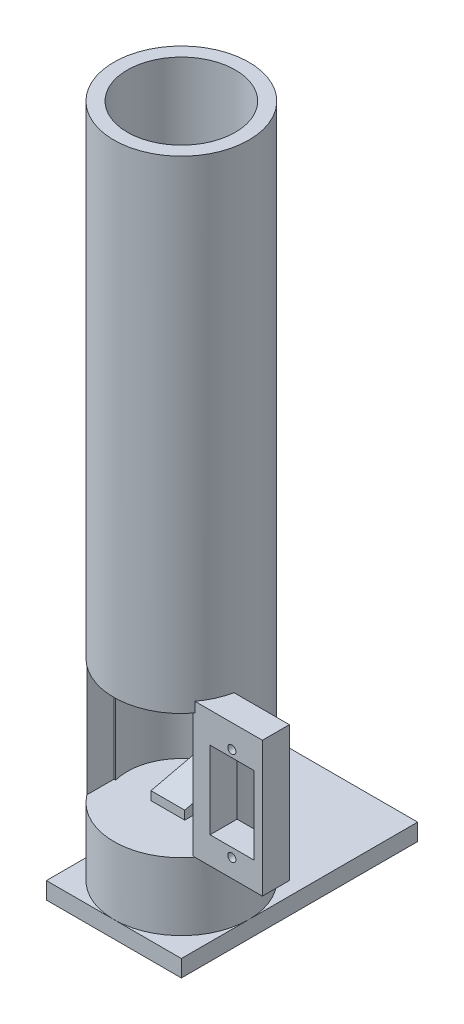
ISO-10303-21;
HEADER;
FILE_DESCRIPTION(('STEP AP214'),'2;1');
FILE_NAME('part.step','',(''),(''),'','','');
FILE_SCHEMA(('AUTOMOTIVE_DESIGN { 1 0 10303 214 1 1 1 1 }'));
ENDSEC;
DATA;
#1=APPLICATION_CONTEXT('core data for automotive mechanical design processes');
#2=APPLICATION_PROTOCOL_DEFINITION('international standard','automotive_design',2000,#1);
#3=PRODUCT_CONTEXT('',#1,'mechanical');
#4=PRODUCT('Part','Part','',(#3));
#5=PRODUCT_RELATED_PRODUCT_CATEGORY('part','',(#4));
#6=PRODUCT_DEFINITION_FORMATION('','',#4);
#7=PRODUCT_DEFINITION_CONTEXT('part definition',#1,'design');
#8=PRODUCT_DEFINITION('design','',#6,#7);
#9=PRODUCT_DEFINITION_SHAPE('','',#8);
#10=(LENGTH_UNIT() NAMED_UNIT(*) SI_UNIT(.MILLI.,.METRE.));
#11=(NAMED_UNIT(*) PLANE_ANGLE_UNIT() SI_UNIT($,.RADIAN.));
#12=(NAMED_UNIT(*) SI_UNIT($,.STERADIAN.) SOLID_ANGLE_UNIT());
#13=UNCERTAINTY_MEASURE_WITH_UNIT(LENGTH_MEASURE(1.E-05),#10,'distance_accuracy_value','');
#14=(GEOMETRIC_REPRESENTATION_CONTEXT(3) GLOBAL_UNCERTAINTY_ASSIGNED_CONTEXT((#13)) GLOBAL_UNIT_ASSIGNED_CONTEXT((#10,
#11,#12)) REPRESENTATION_CONTEXT('',''));
#15=CARTESIAN_POINT('',(0.,0.,0.));
#16=DIRECTION('',(0.,0.,1.));
#17=DIRECTION('',(1.,0.,0.));
#18=AXIS2_PLACEMENT_3D('',#15,#16,#17);
#19=CARTESIAN_POINT('',(20.,25.,20.));
#20=DIRECTION('',(0.,-1.,0.));
#21=DIRECTION('',(0.,0.,-1.));
#22=AXIS2_PLACEMENT_3D('',#19,#20,#21);
#23=CYLINDRICAL_SURFACE('',#22,20.);
#24=CARTESIAN_POINT('',(20.,205.,20.));
#25=DIRECTION('',(0.,1.,0.));
#26=DIRECTION('',(1.,0.,0.));
#27=AXIS2_PLACEMENT_3D('',#24,#25,#26);
#28=CIRCLE('',#27,20.);
#29=CARTESIAN_POINT('',(40.,205.,20.));
#30=VERTEX_POINT('',#29);
#31=EDGE_CURVE('E369',#30,#30,#28,.T.);
#32=ORIENTED_EDGE('',*,*,#31,.F.);
#33=EDGE_LOOP('',(#32));
#34=FACE_BOUND('',#33,.T.);
#35=CARTESIAN_POINT('',(20.,5.,20.));
#36=DIRECTION('',(0.,1.,0.));
#37=DIRECTION('',(0.,0.,1.));
#38=AXIS2_PLACEMENT_3D('',#35,#36,#37);
#39=CIRCLE('',#38,20.);
#40=CARTESIAN_POINT('',(20.,5.,40.));
#41=VERTEX_POINT('',#40);
#42=CARTESIAN_POINT('',(40.,5.,20.));
#43=VERTEX_POINT('',#42);
#44=EDGE_CURVE('E402',#41,#43,#39,.T.);
#45=ORIENTED_EDGE('',*,*,#44,.T.);
#46=CARTESIAN_POINT('',(0.,5.,20.));
#47=VERTEX_POINT('',#46);
#48=EDGE_CURVE('E407',#43,#47,#39,.T.);
#49=ORIENTED_EDGE('',*,*,#48,.T.);
#50=EDGE_CURVE('E408',#47,#41,#39,.T.);
#51=ORIENTED_EDGE('',*,*,#50,.T.);
#52=EDGE_LOOP('',(#45,#49,#51));
#53=FACE_BOUND('',#52,.T.);
#54=DIRECTION('',(0.,-1.,0.));
#55=VECTOR('',#54,1.);
#56=CARTESIAN_POINT('',(36.,25.,32.));
#57=LINE('',#56,#55);
#58=CARTESIAN_POINT('',(36.,65.,32.));
#59=VERTEX_POINT('',#58);
#60=CARTESIAN_POINT('',(36.,62.,32.));
#61=VERTEX_POINT('',#60);
#62=EDGE_CURVE('E315',#59,#61,#57,.T.);
#63=ORIENTED_EDGE('',*,*,#62,.F.);
#64=CARTESIAN_POINT('',(20.,65.,20.));
#65=DIRECTION('',(0.,-1.,0.));
#66=DIRECTION('',(1.,0.,0.));
#67=AXIS2_PLACEMENT_3D('',#64,#65,#66);
#68=CIRCLE('',#67,20.);
#69=CARTESIAN_POINT('',(39.5959179422654,65.,24.));
#70=VERTEX_POINT('',#69);
#71=EDGE_CURVE('E460',#70,#59,#68,.T.);
#72=ORIENTED_EDGE('',*,*,#71,.F.);
#73=DIRECTION('',(0.,-1.,0.));
#74=VECTOR('',#73,1.);
#75=CARTESIAN_POINT('',(39.5959179422654,25.,24.));
#76=LINE('',#75,#74);
#77=CARTESIAN_POINT('',(39.5959179422654,25.,24.));
#78=VERTEX_POINT('',#77);
#79=EDGE_CURVE('E311',#78,#70,#76,.F.);
#80=ORIENTED_EDGE('',*,*,#79,.F.);
#81=CARTESIAN_POINT('',(20.,25.,20.));
#82=DIRECTION('',(0.,1.,0.));
#83=DIRECTION('',(0.,0.,1.));
#84=AXIS2_PLACEMENT_3D('',#81,#82,#83);
#85=CIRCLE('',#84,20.);
#86=CARTESIAN_POINT('',(36.,25.,32.));
#87=VERTEX_POINT('',#86);
#88=EDGE_CURVE('E307',#87,#78,#85,.T.);
#89=ORIENTED_EDGE('',*,*,#88,.F.);
#90=CARTESIAN_POINT('',(20.,25.,20.));
#91=DIRECTION('',(0.,-1.,0.));
#92=DIRECTION('',(0.,0.,-1.));
#93=AXIS2_PLACEMENT_3D('',#90,#91,#92);
#94=CIRCLE('',#93,20.);
#95=CARTESIAN_POINT('',(4.00000000000002,25.,32.));
#96=VERTEX_POINT('',#95);
#97=EDGE_CURVE('E358',#87,#96,#94,.T.);
#98=ORIENTED_EDGE('',*,*,#97,.T.);
#99=DIRECTION('',(0.,-1.,0.));
#100=VECTOR('',#99,1.);
#101=CARTESIAN_POINT('',(4.00000000000002,25.,32.));
#102=LINE('',#101,#100);
#103=CARTESIAN_POINT('',(4.00000000000001,62.,32.));
#104=VERTEX_POINT('',#103);
#105=EDGE_CURVE('E448',#96,#104,#102,.F.);
#106=ORIENTED_EDGE('',*,*,#105,.T.);
#107=CARTESIAN_POINT('',(20.,62.,20.));
#108=DIRECTION('',(0.,1.,0.));
#109=DIRECTION('',(0.,0.,1.));
#110=AXIS2_PLACEMENT_3D('',#107,#108,#109);
#111=CIRCLE('',#110,20.);
#112=EDGE_CURVE('E361',#104,#61,#111,.T.);
#113=ORIENTED_EDGE('',*,*,#112,.T.);
#114=EDGE_LOOP('',(#63,#72,#80,#89,#98,#106,#113));
#115=FACE_BOUND('',#114,.T.);
#116=ADVANCED_FACE('F51',(#34,#53,#115),#23,.T.);
#117=CARTESIAN_POINT('',(20.,25.,20.));
#118=DIRECTION('',(0.,1.,0.));
#119=DIRECTION('',(0.,0.,1.));
#120=AXIS2_PLACEMENT_3D('',#117,#118,#119);
#121=PLANE('',#120);
#122=DIRECTION('',(1.,0.,0.));
#123=VECTOR('',#122,1.);
#124=CARTESIAN_POINT('',(4.00000000000002,25.,24.));
#125=LINE('',#124,#123);
#126=CARTESIAN_POINT('',(15.,25.,24.));
#127=VERTEX_POINT('',#126);
#128=CARTESIAN_POINT('',(25.,25.,24.));
#129=VERTEX_POINT('',#128);
#130=EDGE_CURVE('E332',#127,#129,#125,.T.);
#131=ORIENTED_EDGE('',*,*,#130,.F.);
#132=DIRECTION('',(0.,0.,1.));
#133=VECTOR('',#132,1.);
#134=CARTESIAN_POINT('',(15.,25.,35.));
#135=LINE('',#134,#133);
#136=CARTESIAN_POINT('',(15.,25.,5.));
#137=VERTEX_POINT('',#136);
#138=EDGE_CURVE('E381',#137,#127,#135,.T.);
#139=ORIENTED_EDGE('',*,*,#138,.F.);
#140=DIRECTION('',(1.,0.,0.));
#141=VECTOR('',#140,1.);
#142=CARTESIAN_POINT('',(15.,25.,5.));
#143=LINE('',#142,#141);
#144=CARTESIAN_POINT('',(25.,25.,5.));
#145=VERTEX_POINT('',#144);
#146=EDGE_CURVE('E385',#137,#145,#143,.T.);
#147=ORIENTED_EDGE('',*,*,#146,.T.);
#148=DIRECTION('',(0.,0.,1.));
#149=VECTOR('',#148,1.);
#150=CARTESIAN_POINT('',(25.,25.,35.));
#151=LINE('',#150,#149);
#152=EDGE_CURVE('E378',#145,#129,#151,.T.);
#153=ORIENTED_EDGE('',*,*,#152,.T.);
#154=EDGE_LOOP('',(#131,#139,#147,#153));
#155=FACE_BOUND('',#154,.T.);
#156=ORIENTED_EDGE('',*,*,#97,.F.);
#157=DIRECTION('',(1.,0.,0.));
#158=VECTOR('',#157,1.);
#159=CARTESIAN_POINT('',(35.5,25.,32.));
#160=LINE('',#159,#158);
#161=CARTESIAN_POINT('',(35.5,25.,32.));
#162=VERTEX_POINT('',#161);
#163=EDGE_CURVE('E291',#162,#87,#160,.T.);
#164=ORIENTED_EDGE('',*,*,#163,.F.);
#165=DIRECTION('',(0.,0.,1.));
#166=VECTOR('',#165,1.);
#167=CARTESIAN_POINT('',(35.5,25.,32.));
#168=LINE('',#167,#166);
#169=CARTESIAN_POINT('',(35.5,25.,24.));
#170=VERTEX_POINT('',#169);
#171=EDGE_CURVE('E286',#170,#162,#168,.T.);
#172=ORIENTED_EDGE('',*,*,#171,.F.);
#173=CARTESIAN_POINT('',(35.4919333848297,25.,24.));
#174=VERTEX_POINT('',#173);
#175=EDGE_CURVE('E327',#174,#170,#125,.T.);
#176=ORIENTED_EDGE('',*,*,#175,.F.);
#177=CARTESIAN_POINT('',(20.,25.,20.));
#178=DIRECTION('',(0.,1.,0.));
#179=DIRECTION('',(0.,0.,1.));
#180=AXIS2_PLACEMENT_3D('',#177,#178,#179);
#181=CIRCLE('',#180,16.);
#182=CARTESIAN_POINT('',(4.50806661517033,25.,24.));
#183=VERTEX_POINT('',#182);
#184=EDGE_CURVE('E440',#183,#174,#181,.F.);
#185=ORIENTED_EDGE('',*,*,#184,.F.);
#186=CARTESIAN_POINT('',(4.00000000000002,25.,24.));
#187=VERTEX_POINT('',#186);
#188=EDGE_CURVE('E328',#187,#183,#125,.T.);
#189=ORIENTED_EDGE('',*,*,#188,.F.);
#190=DIRECTION('',(0.,0.,1.));
#191=VECTOR('',#190,1.);
#192=CARTESIAN_POINT('',(4.00000000000002,25.,24.));
#193=LINE('',#192,#191);
#194=EDGE_CURVE('E333',#187,#96,#193,.T.);
#195=ORIENTED_EDGE('',*,*,#194,.T.);
#196=EDGE_LOOP('',(#156,#164,#172,#176,#185,#189,#195));
#197=FACE_BOUND('',#196,.T.);
#198=ADVANCED_FACE('F513',(#155,#197),#121,.T.);
#199=CARTESIAN_POINT('',(4.00000000000001,62.,24.));
#200=DIRECTION('',(0.,1.,0.));
#201=DIRECTION('',(0.,0.,1.));
#202=AXIS2_PLACEMENT_3D('',#199,#200,#201);
#203=PLANE('',#202);
#204=DIRECTION('',(-1.,0.,0.));
#205=VECTOR('',#204,1.);
#206=CARTESIAN_POINT('',(4.00000000000001,62.,32.));
#207=LINE('',#206,#205);
#208=CARTESIAN_POINT('',(35.5,62.,32.));
#209=VERTEX_POINT('',#208);
#210=EDGE_CURVE('E456',#61,#209,#207,.T.);
#211=ORIENTED_EDGE('',*,*,#210,.F.);
#212=ORIENTED_EDGE('',*,*,#112,.F.);
#213=DIRECTION('',(0.,0.,1.));
#214=VECTOR('',#213,1.);
#215=CARTESIAN_POINT('',(4.00000000000001,62.,24.));
#216=LINE('',#215,#214);
#217=CARTESIAN_POINT('',(4.00000000000001,62.,24.));
#218=VERTEX_POINT('',#217);
#219=EDGE_CURVE('E331',#218,#104,#216,.T.);
#220=ORIENTED_EDGE('',*,*,#219,.F.);
#221=DIRECTION('',(-1.,0.,0.));
#222=VECTOR('',#221,1.);
#223=CARTESIAN_POINT('',(4.00000000000001,62.,24.));
#224=LINE('',#223,#222);
#225=CARTESIAN_POINT('',(4.50806661517033,62.,24.));
#226=VERTEX_POINT('',#225);
#227=EDGE_CURVE('E319',#226,#218,#224,.T.);
#228=ORIENTED_EDGE('',*,*,#227,.F.);
#229=CARTESIAN_POINT('',(20.,62.,20.));
#230=DIRECTION('',(0.,1.,0.));
#231=DIRECTION('',(0.,0.,1.));
#232=AXIS2_PLACEMENT_3D('',#229,#230,#231);
#233=CIRCLE('',#232,16.);
#234=CARTESIAN_POINT('',(35.4919333848297,62.,24.));
#235=VERTEX_POINT('',#234);
#236=EDGE_CURVE('E444',#226,#235,#233,.T.);
#237=ORIENTED_EDGE('',*,*,#236,.T.);
#238=CARTESIAN_POINT('',(35.5,62.,24.));
#239=VERTEX_POINT('',#238);
#240=EDGE_CURVE('E320',#239,#235,#224,.T.);
#241=ORIENTED_EDGE('',*,*,#240,.F.);
#242=DIRECTION('',(0.,0.,1.));
#243=VECTOR('',#242,1.);
#244=CARTESIAN_POINT('',(35.5,62.,24.));
#245=LINE('',#244,#243);
#246=EDGE_CURVE('E304',#239,#209,#245,.T.);
#247=ORIENTED_EDGE('',*,*,#246,.T.);
#248=EDGE_LOOP('',(#211,#212,#220,#228,#237,#241,#247));
#249=FACE_BOUND('',#248,.T.);
#250=ADVANCED_FACE('F521',(#249),#203,.F.);
#251=CARTESIAN_POINT('',(20.,205.,20.));
#252=DIRECTION('',(0.,-1.,0.));
#253=DIRECTION('',(0.,0.,-1.));
#254=AXIS2_PLACEMENT_3D('',#251,#252,#253);
#255=CYLINDRICAL_SURFACE('',#254,16.);
#256=CARTESIAN_POINT('',(20.,205.,20.));
#257=DIRECTION('',(0.,1.,0.));
#258=DIRECTION('',(0.,0.,1.));
#259=AXIS2_PLACEMENT_3D('',#256,#257,#258);
#260=CIRCLE('',#259,16.);
#261=CARTESIAN_POINT('',(20.,205.,36.));
#262=VERTEX_POINT('',#261);
#263=EDGE_CURVE('E365',#262,#262,#260,.T.);
#264=ORIENTED_EDGE('',*,*,#263,.T.);
#265=EDGE_LOOP('',(#264));
#266=FACE_BOUND('',#265,.T.);
#267=ORIENTED_EDGE('',*,*,#236,.F.);
#268=DIRECTION('',(0.,-1.,0.));
#269=VECTOR('',#268,1.);
#270=CARTESIAN_POINT('',(4.50806661517033,205.,24.));
#271=LINE('',#270,#269);
#272=EDGE_CURVE('E354',#226,#183,#271,.T.);
#273=ORIENTED_EDGE('',*,*,#272,.T.);
#274=ORIENTED_EDGE('',*,*,#184,.T.);
#275=DIRECTION('',(0.,-1.,0.));
#276=VECTOR('',#275,1.);
#277=CARTESIAN_POINT('',(35.4919333848297,205.,24.));
#278=LINE('',#277,#276);
#279=EDGE_CURVE('E350',#174,#235,#278,.F.);
#280=ORIENTED_EDGE('',*,*,#279,.T.);
#281=EDGE_LOOP('',(#267,#273,#274,#280));
#282=FACE_BOUND('',#281,.T.);
#283=ADVANCED_FACE('F610',(#266,#282),#255,.F.);
#284=CARTESIAN_POINT('',(15.,0.,0.));
#285=DIRECTION('',(-1.,0.,0.));
#286=DIRECTION('',(0.,0.,1.));
#287=AXIS2_PLACEMENT_3D('',#284,#285,#286);
#288=PLANE('',#287);
#289=ORIENTED_EDGE('',*,*,#138,.T.);
#290=DIRECTION('',(0.,1.,0.));
#291=VECTOR('',#290,1.);
#292=CARTESIAN_POINT('',(15.,0.,24.));
#293=LINE('',#292,#291);
#294=CARTESIAN_POINT('',(15.,27.5666666666667,24.));
#295=VERTEX_POINT('',#294);
#296=EDGE_CURVE('E346',#127,#295,#293,.T.);
#297=ORIENTED_EDGE('',*,*,#296,.T.);
#298=DIRECTION('',(0.,0.227229615606418,-0.973841209741793));
#299=VECTOR('',#298,1.);
#300=CARTESIAN_POINT('',(15.,32.,5.));
#301=LINE('',#300,#299);
#302=CARTESIAN_POINT('',(15.,32.,5.));
#303=VERTEX_POINT('',#302);
#304=EDGE_CURVE('E374',#295,#303,#301,.T.);
#305=ORIENTED_EDGE('',*,*,#304,.T.);
#306=DIRECTION('',(0.,-1.,0.));
#307=VECTOR('',#306,1.);
#308=CARTESIAN_POINT('',(15.,25.,5.));
#309=LINE('',#308,#307);
#310=EDGE_CURVE('E377',#303,#137,#309,.T.);
#311=ORIENTED_EDGE('',*,*,#310,.T.);
#312=EDGE_LOOP('',(#289,#297,#305,#311));
#313=FACE_BOUND('',#312,.T.);
#314=ADVANCED_FACE('F797',(#313),#288,.T.);
#315=CARTESIAN_POINT('',(15.,32.,5.));
#316=DIRECTION('',(0.,-0.973841209741793,-0.227229615606418));
#317=DIRECTION('',(0.,0.227229615606418,-0.973841209741793));
#318=AXIS2_PLACEMENT_3D('',#315,#316,#317);
#319=PLANE('',#318);
#320=DIRECTION('',(-1.,0.,0.));
#321=VECTOR('',#320,1.);
#322=CARTESIAN_POINT('',(15.,27.5666666666667,24.));
#323=LINE('',#322,#321);
#324=CARTESIAN_POINT('',(25.,27.5666666666667,24.));
#325=VERTEX_POINT('',#324);
#326=EDGE_CURVE('E343',#325,#295,#323,.T.);
#327=ORIENTED_EDGE('',*,*,#326,.F.);
#328=DIRECTION('',(0.,0.227229615606418,-0.973841209741793));
#329=VECTOR('',#328,1.);
#330=CARTESIAN_POINT('',(25.,32.,5.));
#331=LINE('',#330,#329);
#332=CARTESIAN_POINT('',(25.,32.,5.));
#333=VERTEX_POINT('',#332);
#334=EDGE_CURVE('E373',#325,#333,#331,.T.);
#335=ORIENTED_EDGE('',*,*,#334,.T.);
#336=DIRECTION('',(1.,0.,0.));
#337=VECTOR('',#336,1.);
#338=CARTESIAN_POINT('',(15.,32.,5.));
#339=LINE('',#338,#337);
#340=EDGE_CURVE('E398',#303,#333,#339,.T.);
#341=ORIENTED_EDGE('',*,*,#340,.F.);
#342=ORIENTED_EDGE('',*,*,#304,.F.);
#343=EDGE_LOOP('',(#327,#335,#341,#342));
#344=FACE_BOUND('',#343,.T.);
#345=ADVANCED_FACE('F788',(#344),#319,.F.);
#346=CARTESIAN_POINT('',(25.,0.,0.));
#347=DIRECTION('',(-1.,0.,0.));
#348=DIRECTION('',(0.,0.,1.));
#349=AXIS2_PLACEMENT_3D('',#346,#347,#348);
#350=PLANE('',#349);
#351=DIRECTION('',(0.,1.,0.));
#352=VECTOR('',#351,1.);
#353=CARTESIAN_POINT('',(25.,0.,24.));
#354=LINE('',#353,#352);
#355=EDGE_CURVE('E337',#129,#325,#354,.T.);
#356=ORIENTED_EDGE('',*,*,#355,.F.);
#357=ORIENTED_EDGE('',*,*,#152,.F.);
#358=DIRECTION('',(0.,-1.,0.));
#359=VECTOR('',#358,1.);
#360=CARTESIAN_POINT('',(25.,25.,5.));
#361=LINE('',#360,#359);
#362=EDGE_CURVE('E388',#333,#145,#361,.T.);
#363=ORIENTED_EDGE('',*,*,#362,.F.);
#364=ORIENTED_EDGE('',*,*,#334,.F.);
#365=EDGE_LOOP('',(#356,#357,#363,#364));
#366=FACE_BOUND('',#365,.T.);
#367=ADVANCED_FACE('F761',(#366),#350,.F.);
#368=CARTESIAN_POINT('',(0.,5.,0.));
#369=DIRECTION('',(0.,1.,0.));
#370=DIRECTION('',(0.,0.,1.));
#371=AXIS2_PLACEMENT_3D('',#368,#369,#370);
#372=PLANE('',#371);
#373=ORIENTED_EDGE('',*,*,#44,.F.);
#374=DIRECTION('',(1.,0.,0.));
#375=VECTOR('',#374,1.);
#376=CARTESIAN_POINT('',(0.,5.,40.));
#377=LINE('',#376,#375);
#378=CARTESIAN_POINT('',(40.,5.,40.));
#379=VERTEX_POINT('',#378);
#380=EDGE_CURVE('E413',#41,#379,#377,.T.);
#381=ORIENTED_EDGE('',*,*,#380,.T.);
#382=DIRECTION('',(0.,0.,-1.));
#383=VECTOR('',#382,1.);
#384=CARTESIAN_POINT('',(40.,5.,0.));
#385=LINE('',#384,#383);
#386=EDGE_CURVE('E419',#379,#43,#385,.T.);
#387=ORIENTED_EDGE('',*,*,#386,.T.);
#388=EDGE_LOOP('',(#373,#381,#387));
#389=FACE_BOUND('',#388,.T.);
#390=ADVANCED_FACE('F534',(#389),#372,.T.);
#391=ORIENTED_EDGE('',*,*,#48,.F.);
#392=CARTESIAN_POINT('',(40.,5.,-30.));
#393=VERTEX_POINT('',#392);
#394=EDGE_CURVE('E418',#43,#393,#385,.T.);
#395=ORIENTED_EDGE('',*,*,#394,.T.);
#396=DIRECTION('',(1.,0.,0.));
#397=VECTOR('',#396,1.);
#398=CARTESIAN_POINT('',(40.,5.,-30.));
#399=LINE('',#398,#397);
#400=CARTESIAN_POINT('',(0.,5.,-30.));
#401=VERTEX_POINT('',#400);
#402=EDGE_CURVE('E262',#401,#393,#399,.T.);
#403=ORIENTED_EDGE('',*,*,#402,.F.);
#404=DIRECTION('',(0.,0.,1.));
#405=VECTOR('',#404,1.);
#406=CARTESIAN_POINT('',(0.,5.,0.));
#407=LINE('',#406,#405);
#408=EDGE_CURVE('E409',#401,#47,#407,.T.);
#409=ORIENTED_EDGE('',*,*,#408,.T.);
#410=EDGE_LOOP('',(#391,#395,#403,#409));
#411=FACE_BOUND('',#410,.T.);
#412=ADVANCED_FACE('F535',(#411),#372,.T.);
#413=CARTESIAN_POINT('',(0.,5.,0.));
#414=DIRECTION('',(1.,0.,0.));
#415=DIRECTION('',(0.,0.,-1.));
#416=AXIS2_PLACEMENT_3D('',#413,#414,#415);
#417=PLANE('',#416);
#418=DIRECTION('',(0.,0.,1.));
#419=VECTOR('',#418,1.);
#420=CARTESIAN_POINT('',(0.,0.,0.));
#421=LINE('',#420,#419);
#422=CARTESIAN_POINT('',(0.,0.,-30.));
#423=VERTEX_POINT('',#422);
#424=CARTESIAN_POINT('',(0.,0.,40.));
#425=VERTEX_POINT('',#424);
#426=EDGE_CURVE('E406',#423,#425,#421,.T.);
#427=ORIENTED_EDGE('',*,*,#426,.T.);
#428=DIRECTION('',(0.,-1.,0.));
#429=VECTOR('',#428,1.);
#430=CARTESIAN_POINT('',(0.,5.,40.));
#431=LINE('',#430,#429);
#432=CARTESIAN_POINT('',(0.,5.,40.));
#433=VERTEX_POINT('',#432);
#434=EDGE_CURVE('E436',#433,#425,#431,.T.);
#435=ORIENTED_EDGE('',*,*,#434,.F.);
#436=EDGE_CURVE('E414',#47,#433,#407,.T.);
#437=ORIENTED_EDGE('',*,*,#436,.F.);
#438=ORIENTED_EDGE('',*,*,#408,.F.);
#439=DIRECTION('',(0.,1.,0.));
#440=VECTOR('',#439,1.);
#441=CARTESIAN_POINT('',(0.,5.,-30.));
#442=LINE('',#441,#440);
#443=EDGE_CURVE('E258',#423,#401,#442,.T.);
#444=ORIENTED_EDGE('',*,*,#443,.F.);
#445=EDGE_LOOP('',(#427,#435,#437,#438,#444));
#446=FACE_BOUND('',#445,.T.);
#447=ADVANCED_FACE('F53',(#446),#417,.F.);
#448=CARTESIAN_POINT('',(0.,5.,40.));
#449=DIRECTION('',(0.,0.,-1.));
#450=DIRECTION('',(-1.,0.,0.));
#451=AXIS2_PLACEMENT_3D('',#448,#449,#450);
#452=PLANE('',#451);
#453=DIRECTION('',(1.,0.,0.));
#454=VECTOR('',#453,1.);
#455=CARTESIAN_POINT('',(0.,0.,40.));
#456=LINE('',#455,#454);
#457=CARTESIAN_POINT('',(40.,0.,40.));
#458=VERTEX_POINT('',#457);
#459=EDGE_CURVE('E427',#425,#458,#456,.T.);
#460=ORIENTED_EDGE('',*,*,#459,.T.);
#461=DIRECTION('',(0.,-1.,0.));
#462=VECTOR('',#461,1.);
#463=CARTESIAN_POINT('',(40.,5.,40.));
#464=LINE('',#463,#462);
#465=EDGE_CURVE('E423',#379,#458,#464,.T.);
#466=ORIENTED_EDGE('',*,*,#465,.F.);
#467=ORIENTED_EDGE('',*,*,#380,.F.);
#468=EDGE_CURVE('E415',#433,#41,#377,.T.);
#469=ORIENTED_EDGE('',*,*,#468,.F.);
#470=ORIENTED_EDGE('',*,*,#434,.T.);
#471=EDGE_LOOP('',(#460,#466,#467,#469,#470));
#472=FACE_BOUND('',#471,.T.);
#473=ADVANCED_FACE('F541',(#472),#452,.F.);
#474=CARTESIAN_POINT('',(40.,5.,0.));
#475=DIRECTION('',(-1.,0.,0.));
#476=DIRECTION('',(0.,0.,1.));
#477=AXIS2_PLACEMENT_3D('',#474,#475,#476);
#478=PLANE('',#477);
#479=DIRECTION('',(0.,0.,-1.));
#480=VECTOR('',#479,1.);
#481=CARTESIAN_POINT('',(40.,0.,0.));
#482=LINE('',#481,#480);
#483=CARTESIAN_POINT('',(40.,0.,-30.));
#484=VERTEX_POINT('',#483);
#485=EDGE_CURVE('E430',#458,#484,#482,.T.);
#486=ORIENTED_EDGE('',*,*,#485,.T.);
#487=DIRECTION('',(0.,-1.,0.));
#488=VECTOR('',#487,1.);
#489=CARTESIAN_POINT('',(40.,5.,-30.));
#490=LINE('',#489,#488);
#491=EDGE_CURVE('E246',#393,#484,#490,.T.);
#492=ORIENTED_EDGE('',*,*,#491,.F.);
#493=ORIENTED_EDGE('',*,*,#394,.F.);
#494=ORIENTED_EDGE('',*,*,#386,.F.);
#495=ORIENTED_EDGE('',*,*,#465,.T.);
#496=EDGE_LOOP('',(#486,#492,#493,#494,#495));
#497=FACE_BOUND('',#496,.T.);
#498=ADVANCED_FACE('F532',(#497),#478,.F.);
#499=ORIENTED_EDGE('',*,*,#50,.F.);
#500=ORIENTED_EDGE('',*,*,#436,.T.);
#501=ORIENTED_EDGE('',*,*,#468,.T.);
#502=EDGE_LOOP('',(#499,#500,#501));
#503=FACE_BOUND('',#502,.T.);
#504=ADVANCED_FACE('F528',(#503),#372,.T.);
#505=CARTESIAN_POINT('',(0.,0.,0.));
#506=DIRECTION('',(0.,1.,0.));
#507=DIRECTION('',(0.,0.,1.));
#508=AXIS2_PLACEMENT_3D('',#505,#506,#507);
#509=PLANE('',#508);
#510=ORIENTED_EDGE('',*,*,#426,.F.);
#511=DIRECTION('',(-1.,0.,0.));
#512=VECTOR('',#511,1.);
#513=CARTESIAN_POINT('',(40.,0.,-30.));
#514=LINE('',#513,#512);
#515=EDGE_CURVE('E254',#484,#423,#514,.T.);
#516=ORIENTED_EDGE('',*,*,#515,.F.);
#517=ORIENTED_EDGE('',*,*,#485,.F.);
#518=ORIENTED_EDGE('',*,*,#459,.F.);
#519=EDGE_LOOP('',(#510,#516,#517,#518));
#520=FACE_BOUND('',#519,.T.);
#521=ADVANCED_FACE('F531',(#520),#509,.F.);
#522=CARTESIAN_POINT('',(20.,205.,20.));
#523=DIRECTION('',(0.,1.,0.));
#524=DIRECTION('',(0.,0.,1.));
#525=AXIS2_PLACEMENT_3D('',#522,#523,#524);
#526=PLANE('',#525);
#527=ORIENTED_EDGE('',*,*,#31,.T.);
#528=EDGE_LOOP('',(#527));
#529=FACE_BOUND('',#528,.T.);
#530=ORIENTED_EDGE('',*,*,#263,.F.);
#531=EDGE_LOOP('',(#530));
#532=FACE_BOUND('',#531,.T.);
#533=ADVANCED_FACE('F538',(#529,#532),#526,.T.);
#534=CARTESIAN_POINT('',(15.,25.,5.));
#535=DIRECTION('',(0.,0.,1.));
#536=DIRECTION('',(1.,0.,0.));
#537=AXIS2_PLACEMENT_3D('',#534,#535,#536);
#538=PLANE('',#537);
#539=ORIENTED_EDGE('',*,*,#362,.T.);
#540=ORIENTED_EDGE('',*,*,#146,.F.);
#541=ORIENTED_EDGE('',*,*,#310,.F.);
#542=ORIENTED_EDGE('',*,*,#340,.T.);
#543=EDGE_LOOP('',(#539,#540,#541,#542));
#544=FACE_BOUND('',#543,.T.);
#545=ADVANCED_FACE('F764',(#544),#538,.F.);
#546=CARTESIAN_POINT('',(0.,0.,24.));
#547=DIRECTION('',(0.,0.,1.));
#548=DIRECTION('',(1.,0.,0.));
#549=AXIS2_PLACEMENT_3D('',#546,#547,#548);
#550=PLANE('',#549);
#551=ORIENTED_EDGE('',*,*,#130,.T.);
#552=ORIENTED_EDGE('',*,*,#355,.T.);
#553=ORIENTED_EDGE('',*,*,#326,.T.);
#554=ORIENTED_EDGE('',*,*,#296,.F.);
#555=EDGE_LOOP('',(#551,#552,#553,#554));
#556=FACE_BOUND('',#555,.T.);
#557=ADVANCED_FACE('F510',(#556),#550,.T.);
#558=CARTESIAN_POINT('',(4.00000000000001,62.,24.));
#559=DIRECTION('',(-1.,0.,0.));
#560=DIRECTION('',(0.,-1.,0.));
#561=AXIS2_PLACEMENT_3D('',#558,#559,#560);
#562=PLANE('',#561);
#563=ORIENTED_EDGE('',*,*,#194,.F.);
#564=DIRECTION('',(0.,-1.,0.));
#565=VECTOR('',#564,1.);
#566=CARTESIAN_POINT('',(4.00000000000001,62.,24.));
#567=LINE('',#566,#565);
#568=EDGE_CURVE('E323',#218,#187,#567,.T.);
#569=ORIENTED_EDGE('',*,*,#568,.F.);
#570=ORIENTED_EDGE('',*,*,#219,.T.);
#571=ORIENTED_EDGE('',*,*,#105,.F.);
#572=EDGE_LOOP('',(#563,#569,#570,#571));
#573=FACE_BOUND('',#572,.T.);
#574=ADVANCED_FACE('F600',(#573),#562,.F.);
#575=ORIENTED_EDGE('',*,*,#227,.T.);
#576=ORIENTED_EDGE('',*,*,#568,.T.);
#577=ORIENTED_EDGE('',*,*,#188,.T.);
#578=ORIENTED_EDGE('',*,*,#272,.F.);
#579=EDGE_LOOP('',(#575,#576,#577,#578));
#580=FACE_BOUND('',#579,.T.);
#581=ADVANCED_FACE('F507',(#580),#550,.T.);
#582=DIRECTION('',(0.,-1.,0.));
#583=VECTOR('',#582,1.);
#584=CARTESIAN_POINT('',(35.5,0.,24.));
#585=LINE('',#584,#583);
#586=EDGE_CURVE('E452',#239,#170,#585,.T.);
#587=ORIENTED_EDGE('',*,*,#586,.F.);
#588=ORIENTED_EDGE('',*,*,#240,.T.);
#589=ORIENTED_EDGE('',*,*,#279,.F.);
#590=ORIENTED_EDGE('',*,*,#175,.T.);
#591=EDGE_LOOP('',(#587,#588,#589,#590));
#592=FACE_BOUND('',#591,.T.);
#593=ADVANCED_FACE('F496',(#592),#550,.T.);
#594=CARTESIAN_POINT('',(35.5,25.,32.));
#595=DIRECTION('',(0.,0.,-1.));
#596=DIRECTION('',(-1.,0.,0.));
#597=AXIS2_PLACEMENT_3D('',#594,#595,#596);
#598=PLANE('',#597);
#599=CARTESIAN_POINT('',(46.95,30.3999999999999,32.));
#600=DIRECTION('',(0.,0.,1.));
#601=DIRECTION('',(1.,0.,0.));
#602=AXIS2_PLACEMENT_3D('',#599,#600,#601);
#603=CIRCLE('',#602,1.2);
#604=CARTESIAN_POINT('',(48.15,30.3999999999999,32.));
#605=VERTEX_POINT('',#604);
#606=EDGE_CURVE('E474',#605,#605,#603,.T.);
#607=ORIENTED_EDGE('',*,*,#606,.F.);
#608=EDGE_LOOP('',(#607));
#609=FACE_BOUND('',#608,.T.);
#610=CARTESIAN_POINT('',(46.95,58.0999999999999,32.));
#611=DIRECTION('',(0.,0.,1.));
#612=DIRECTION('',(1.,0.,0.));
#613=AXIS2_PLACEMENT_3D('',#610,#611,#612);
#614=CIRCLE('',#613,1.2);
#615=CARTESIAN_POINT('',(48.15,58.0999999999999,32.));
#616=VERTEX_POINT('',#615);
#617=EDGE_CURVE('E481',#616,#616,#614,.T.);
#618=ORIENTED_EDGE('',*,*,#617,.F.);
#619=EDGE_LOOP('',(#618));
#620=FACE_BOUND('',#619,.T.);
#621=DIRECTION('',(-1.,0.,0.));
#622=VECTOR('',#621,1.);
#623=CARTESIAN_POINT('',(40.5,56.,32.));
#624=LINE('',#623,#622);
#625=CARTESIAN_POINT('',(53.5,56.,32.));
#626=VERTEX_POINT('',#625);
#627=CARTESIAN_POINT('',(40.5,56.,32.));
#628=VERTEX_POINT('',#627);
#629=EDGE_CURVE('E228',#626,#628,#624,.T.);
#630=ORIENTED_EDGE('',*,*,#629,.F.);
#631=DIRECTION('',(0.,1.,0.));
#632=VECTOR('',#631,1.);
#633=CARTESIAN_POINT('',(53.5,56.,32.));
#634=LINE('',#633,#632);
#635=CARTESIAN_POINT('',(53.5,33.,32.));
#636=VERTEX_POINT('',#635);
#637=EDGE_CURVE('E69',#636,#626,#634,.T.);
#638=ORIENTED_EDGE('',*,*,#637,.F.);
#639=DIRECTION('',(1.,0.,0.));
#640=VECTOR('',#639,1.);
#641=CARTESIAN_POINT('',(40.5,33.,32.));
#642=LINE('',#641,#640);
#643=CARTESIAN_POINT('',(40.5,33.,32.));
#644=VERTEX_POINT('',#643);
#645=EDGE_CURVE('E236',#644,#636,#642,.T.);
#646=ORIENTED_EDGE('',*,*,#645,.F.);
#647=DIRECTION('',(0.,-1.,0.));
#648=VECTOR('',#647,1.);
#649=CARTESIAN_POINT('',(40.5,56.,32.));
#650=LINE('',#649,#648);
#651=EDGE_CURVE('E218',#628,#644,#650,.T.);
#652=ORIENTED_EDGE('',*,*,#651,.F.);
#653=EDGE_LOOP('',(#630,#638,#646,#652));
#654=FACE_BOUND('',#653,.T.);
#655=DIRECTION('',(1.,0.,0.));
#656=VECTOR('',#655,1.);
#657=CARTESIAN_POINT('',(35.5,65.,32.));
#658=LINE('',#657,#656);
#659=CARTESIAN_POINT('',(56.,65.,32.));
#660=VERTEX_POINT('',#659);
#661=EDGE_CURVE('E301',#59,#660,#658,.T.);
#662=ORIENTED_EDGE('',*,*,#661,.F.);
#663=ORIENTED_EDGE('',*,*,#62,.T.);
#664=ORIENTED_EDGE('',*,*,#210,.T.);
#665=DIRECTION('',(0.,1.,0.));
#666=VECTOR('',#665,1.);
#667=CARTESIAN_POINT('',(35.5,25.,32.));
#668=LINE('',#667,#666);
#669=EDGE_CURVE('E282',#162,#209,#668,.T.);
#670=ORIENTED_EDGE('',*,*,#669,.F.);
#671=ORIENTED_EDGE('',*,*,#163,.T.);
#672=CARTESIAN_POINT('',(56.,25.,32.));
#673=VERTEX_POINT('',#672);
#674=EDGE_CURVE('E290',#87,#673,#160,.T.);
#675=ORIENTED_EDGE('',*,*,#674,.T.);
#676=DIRECTION('',(0.,1.,0.));
#677=VECTOR('',#676,1.);
#678=CARTESIAN_POINT('',(56.,25.,32.));
#679=LINE('',#678,#677);
#680=EDGE_CURVE('E266',#673,#660,#679,.T.);
#681=ORIENTED_EDGE('',*,*,#680,.T.);
#682=EDGE_LOOP('',(#662,#663,#664,#670,#671,#675,#681));
#683=FACE_BOUND('',#682,.T.);
#684=ADVANCED_FACE('F233',(#609,#620,#654,#683),#598,.F.);
#685=CARTESIAN_POINT('',(35.5,25.,24.));
#686=DIRECTION('',(0.,0.,1.));
#687=DIRECTION('',(1.,0.,0.));
#688=AXIS2_PLACEMENT_3D('',#685,#686,#687);
#689=PLANE('',#688);
#690=CARTESIAN_POINT('',(46.95,30.3999999999999,24.));
#691=DIRECTION('',(0.,0.,1.));
#692=DIRECTION('',(1.,0.,0.));
#693=AXIS2_PLACEMENT_3D('',#690,#691,#692);
#694=CIRCLE('',#693,1.2);
#695=CARTESIAN_POINT('',(48.15,30.3999999999999,24.));
#696=VERTEX_POINT('',#695);
#697=EDGE_CURVE('E55',#696,#696,#694,.T.);
#698=ORIENTED_EDGE('',*,*,#697,.T.);
#699=EDGE_LOOP('',(#698));
#700=FACE_BOUND('',#699,.T.);
#701=CARTESIAN_POINT('',(46.95,58.0999999999999,24.));
#702=DIRECTION('',(0.,0.,1.));
#703=DIRECTION('',(1.,0.,0.));
#704=AXIS2_PLACEMENT_3D('',#701,#702,#703);
#705=CIRCLE('',#704,1.2);
#706=CARTESIAN_POINT('',(48.15,58.0999999999999,24.));
#707=VERTEX_POINT('',#706);
#708=EDGE_CURVE('E471',#707,#707,#705,.T.);
#709=ORIENTED_EDGE('',*,*,#708,.T.);
#710=EDGE_LOOP('',(#709));
#711=FACE_BOUND('',#710,.T.);
#712=DIRECTION('',(1.,0.,0.));
#713=VECTOR('',#712,1.);
#714=CARTESIAN_POINT('',(35.5,33.,24.));
#715=LINE('',#714,#713);
#716=CARTESIAN_POINT('',(40.5,33.,24.));
#717=VERTEX_POINT('',#716);
#718=CARTESIAN_POINT('',(53.5,33.,24.));
#719=VERTEX_POINT('',#718);
#720=EDGE_CURVE('E61',#717,#719,#715,.T.);
#721=ORIENTED_EDGE('',*,*,#720,.T.);
#722=DIRECTION('',(0.,1.,0.));
#723=VECTOR('',#722,1.);
#724=CARTESIAN_POINT('',(53.5,25.,24.));
#725=LINE('',#724,#723);
#726=CARTESIAN_POINT('',(53.5,56.,24.));
#727=VERTEX_POINT('',#726);
#728=EDGE_CURVE('E12',#719,#727,#725,.T.);
#729=ORIENTED_EDGE('',*,*,#728,.T.);
#730=DIRECTION('',(-1.,0.,0.));
#731=VECTOR('',#730,1.);
#732=CARTESIAN_POINT('',(35.5,56.,24.));
#733=LINE('',#732,#731);
#734=CARTESIAN_POINT('',(40.5,56.,24.));
#735=VERTEX_POINT('',#734);
#736=EDGE_CURVE('E464',#727,#735,#733,.T.);
#737=ORIENTED_EDGE('',*,*,#736,.T.);
#738=DIRECTION('',(0.,-1.,0.));
#739=VECTOR('',#738,1.);
#740=CARTESIAN_POINT('',(40.5,25.,24.));
#741=LINE('',#740,#739);
#742=EDGE_CURVE('E221',#735,#717,#741,.T.);
#743=ORIENTED_EDGE('',*,*,#742,.T.);
#744=EDGE_LOOP('',(#721,#729,#737,#743));
#745=FACE_BOUND('',#744,.T.);
#746=DIRECTION('',(1.,0.,0.));
#747=VECTOR('',#746,1.);
#748=CARTESIAN_POINT('',(35.5,25.,24.));
#749=LINE('',#748,#747);
#750=CARTESIAN_POINT('',(56.,25.,24.));
#751=VERTEX_POINT('',#750);
#752=EDGE_CURVE('E295',#78,#751,#749,.T.);
#753=ORIENTED_EDGE('',*,*,#752,.F.);
#754=ORIENTED_EDGE('',*,*,#79,.T.);
#755=DIRECTION('',(1.,0.,0.));
#756=VECTOR('',#755,1.);
#757=CARTESIAN_POINT('',(35.5,65.,24.));
#758=LINE('',#757,#756);
#759=CARTESIAN_POINT('',(56.,65.,24.));
#760=VERTEX_POINT('',#759);
#761=EDGE_CURVE('E298',#70,#760,#758,.T.);
#762=ORIENTED_EDGE('',*,*,#761,.T.);
#763=DIRECTION('',(0.,-1.,0.));
#764=VECTOR('',#763,1.);
#765=CARTESIAN_POINT('',(56.,25.,24.));
#766=LINE('',#765,#764);
#767=EDGE_CURVE('E274',#760,#751,#766,.T.);
#768=ORIENTED_EDGE('',*,*,#767,.T.);
#769=EDGE_LOOP('',(#753,#754,#762,#768));
#770=FACE_BOUND('',#769,.T.);
#771=ADVANCED_FACE('F495',(#700,#711,#745,#770),#689,.F.);
#772=CARTESIAN_POINT('',(35.5,25.,32.));
#773=DIRECTION('',(0.,1.,0.));
#774=DIRECTION('',(0.,0.,1.));
#775=AXIS2_PLACEMENT_3D('',#772,#773,#774);
#776=PLANE('',#775);
#777=ORIENTED_EDGE('',*,*,#674,.F.);
#778=ORIENTED_EDGE('',*,*,#88,.T.);
#779=ORIENTED_EDGE('',*,*,#752,.T.);
#780=DIRECTION('',(0.,0.,1.));
#781=VECTOR('',#780,1.);
#782=CARTESIAN_POINT('',(56.,25.,32.));
#783=LINE('',#782,#781);
#784=EDGE_CURVE('E278',#751,#673,#783,.T.);
#785=ORIENTED_EDGE('',*,*,#784,.T.);
#786=EDGE_LOOP('',(#777,#778,#779,#785));
#787=FACE_BOUND('',#786,.T.);
#788=ADVANCED_FACE('F503',(#787),#776,.F.);
#789=CARTESIAN_POINT('',(35.5,0.,0.));
#790=DIRECTION('',(-1.,0.,0.));
#791=DIRECTION('',(0.,-1.,0.));
#792=AXIS2_PLACEMENT_3D('',#789,#790,#791);
#793=PLANE('',#792);
#794=ORIENTED_EDGE('',*,*,#246,.F.);
#795=ORIENTED_EDGE('',*,*,#586,.T.);
#796=ORIENTED_EDGE('',*,*,#171,.T.);
#797=ORIENTED_EDGE('',*,*,#669,.T.);
#798=EDGE_LOOP('',(#794,#795,#796,#797));
#799=FACE_BOUND('',#798,.T.);
#800=ADVANCED_FACE('F614',(#799),#793,.T.);
#801=CARTESIAN_POINT('',(35.5,65.,32.));
#802=DIRECTION('',(0.,-1.,0.));
#803=DIRECTION('',(1.,0.,0.));
#804=AXIS2_PLACEMENT_3D('',#801,#802,#803);
#805=PLANE('',#804);
#806=ORIENTED_EDGE('',*,*,#761,.F.);
#807=ORIENTED_EDGE('',*,*,#71,.T.);
#808=ORIENTED_EDGE('',*,*,#661,.T.);
#809=DIRECTION('',(0.,0.,-1.));
#810=VECTOR('',#809,1.);
#811=CARTESIAN_POINT('',(56.,65.,32.));
#812=LINE('',#811,#810);
#813=EDGE_CURVE('E270',#660,#760,#812,.T.);
#814=ORIENTED_EDGE('',*,*,#813,.T.);
#815=EDGE_LOOP('',(#806,#807,#808,#814));
#816=FACE_BOUND('',#815,.T.);
#817=ADVANCED_FACE('F593',(#816),#805,.F.);
#818=CARTESIAN_POINT('',(56.,0.,0.));
#819=DIRECTION('',(-1.,0.,0.));
#820=DIRECTION('',(0.,-1.,0.));
#821=AXIS2_PLACEMENT_3D('',#818,#819,#820);
#822=PLANE('',#821);
#823=ORIENTED_EDGE('',*,*,#680,.F.);
#824=ORIENTED_EDGE('',*,*,#784,.F.);
#825=ORIENTED_EDGE('',*,*,#767,.F.);
#826=ORIENTED_EDGE('',*,*,#813,.F.);
#827=EDGE_LOOP('',(#823,#824,#825,#826));
#828=FACE_BOUND('',#827,.T.);
#829=ADVANCED_FACE('F587',(#828),#822,.F.);
#830=CARTESIAN_POINT('',(0.,0.,-30.));
#831=DIRECTION('',(0.,0.,-1.));
#832=DIRECTION('',(-1.,0.,0.));
#833=AXIS2_PLACEMENT_3D('',#830,#831,#832);
#834=PLANE('',#833);
#835=ORIENTED_EDGE('',*,*,#491,.T.);
#836=ORIENTED_EDGE('',*,*,#515,.T.);
#837=ORIENTED_EDGE('',*,*,#443,.T.);
#838=ORIENTED_EDGE('',*,*,#402,.T.);
#839=EDGE_LOOP('',(#835,#836,#837,#838));
#840=FACE_BOUND('',#839,.T.);
#841=ADVANCED_FACE('F561',(#840),#834,.T.);
#842=CARTESIAN_POINT('',(53.5,56.,12.));
#843=DIRECTION('',(1.,0.,0.));
#844=DIRECTION('',(0.,0.,-1.));
#845=AXIS2_PLACEMENT_3D('',#842,#843,#844);
#846=PLANE('',#845);
#847=DIRECTION('',(0.,0.,1.));
#848=VECTOR('',#847,1.);
#849=CARTESIAN_POINT('',(53.5,33.,12.));
#850=LINE('',#849,#848);
#851=EDGE_CURVE('E243',#719,#636,#850,.T.);
#852=ORIENTED_EDGE('',*,*,#851,.T.);
#853=ORIENTED_EDGE('',*,*,#637,.T.);
#854=DIRECTION('',(0.,0.,1.));
#855=VECTOR('',#854,1.);
#856=CARTESIAN_POINT('',(53.5,56.,12.));
#857=LINE('',#856,#855);
#858=EDGE_CURVE('E225',#727,#626,#857,.T.);
#859=ORIENTED_EDGE('',*,*,#858,.F.);
#860=ORIENTED_EDGE('',*,*,#728,.F.);
#861=EDGE_LOOP('',(#852,#853,#859,#860));
#862=FACE_BOUND('',#861,.T.);
#863=ADVANCED_FACE('F626',(#862),#846,.F.);
#864=CARTESIAN_POINT('',(40.5,33.,12.));
#865=DIRECTION('',(0.,-1.,0.));
#866=DIRECTION('',(0.,0.,-1.));
#867=AXIS2_PLACEMENT_3D('',#864,#865,#866);
#868=PLANE('',#867);
#869=DIRECTION('',(0.,0.,1.));
#870=VECTOR('',#869,1.);
#871=CARTESIAN_POINT('',(40.5,33.,12.));
#872=LINE('',#871,#870);
#873=EDGE_CURVE('E224',#717,#644,#872,.T.);
#874=ORIENTED_EDGE('',*,*,#873,.T.);
#875=ORIENTED_EDGE('',*,*,#645,.T.);
#876=ORIENTED_EDGE('',*,*,#851,.F.);
#877=ORIENTED_EDGE('',*,*,#720,.F.);
#878=EDGE_LOOP('',(#874,#875,#876,#877));
#879=FACE_BOUND('',#878,.T.);
#880=ADVANCED_FACE('F629',(#879),#868,.F.);
#881=CARTESIAN_POINT('',(40.5,56.,12.));
#882=DIRECTION('',(-1.,0.,0.));
#883=DIRECTION('',(0.,0.,1.));
#884=AXIS2_PLACEMENT_3D('',#881,#882,#883);
#885=PLANE('',#884);
#886=DIRECTION('',(0.,0.,1.));
#887=VECTOR('',#886,1.);
#888=CARTESIAN_POINT('',(40.5,56.,12.));
#889=LINE('',#888,#887);
#890=EDGE_CURVE('E77',#735,#628,#889,.T.);
#891=ORIENTED_EDGE('',*,*,#890,.T.);
#892=ORIENTED_EDGE('',*,*,#651,.T.);
#893=ORIENTED_EDGE('',*,*,#873,.F.);
#894=ORIENTED_EDGE('',*,*,#742,.F.);
#895=EDGE_LOOP('',(#891,#892,#893,#894));
#896=FACE_BOUND('',#895,.T.);
#897=ADVANCED_FACE('F215',(#896),#885,.F.);
#898=CARTESIAN_POINT('',(40.5,56.,12.));
#899=DIRECTION('',(0.,1.,0.));
#900=DIRECTION('',(0.,0.,1.));
#901=AXIS2_PLACEMENT_3D('',#898,#899,#900);
#902=PLANE('',#901);
#903=ORIENTED_EDGE('',*,*,#858,.T.);
#904=ORIENTED_EDGE('',*,*,#629,.T.);
#905=ORIENTED_EDGE('',*,*,#890,.F.);
#906=ORIENTED_EDGE('',*,*,#736,.F.);
#907=EDGE_LOOP('',(#903,#904,#905,#906));
#908=FACE_BOUND('',#907,.T.);
#909=ADVANCED_FACE('F229',(#908),#902,.F.);
#910=CARTESIAN_POINT('',(46.95,58.0999999999999,22.));
#911=DIRECTION('',(0.,0.,1.));
#912=DIRECTION('',(1.,0.,0.));
#913=AXIS2_PLACEMENT_3D('',#910,#911,#912);
#914=CYLINDRICAL_SURFACE('',#913,1.2);
#915=ORIENTED_EDGE('',*,*,#617,.T.);
#916=EDGE_LOOP('',(#915));
#917=FACE_BOUND('',#916,.T.);
#918=ORIENTED_EDGE('',*,*,#708,.F.);
#919=EDGE_LOOP('',(#918));
#920=FACE_BOUND('',#919,.T.);
#921=ADVANCED_FACE('F491',(#917,#920),#914,.F.);
#922=CARTESIAN_POINT('',(46.95,30.3999999999999,22.));
#923=DIRECTION('',(0.,0.,1.));
#924=DIRECTION('',(1.,0.,0.));
#925=AXIS2_PLACEMENT_3D('',#922,#923,#924);
#926=CYLINDRICAL_SURFACE('',#925,1.2);
#927=ORIENTED_EDGE('',*,*,#606,.T.);
#928=EDGE_LOOP('',(#927));
#929=FACE_BOUND('',#928,.T.);
#930=ORIENTED_EDGE('',*,*,#697,.F.);
#931=EDGE_LOOP('',(#930));
#932=FACE_BOUND('',#931,.T.);
#933=ADVANCED_FACE('F638',(#929,#932),#926,.F.);
#934=CLOSED_SHELL('',(#116,#198,#250,#283,#314,#345,#367,#390,#412,#447,#473,#498,#504,#521,
#533,#545,#557,#574,#581,#593,#684,#771,#788,#800,#817,#829,#841,#863,#880,#897,#909,#921,#933));
#935=MANIFOLD_SOLID_BREP('B2',#934);
#936=ADVANCED_BREP_SHAPE_REPRESENTATION('',(#18,#935),#14);
#937=SHAPE_DEFINITION_REPRESENTATION(#9,#936);
ENDSEC;
END-ISO-10303-21;
